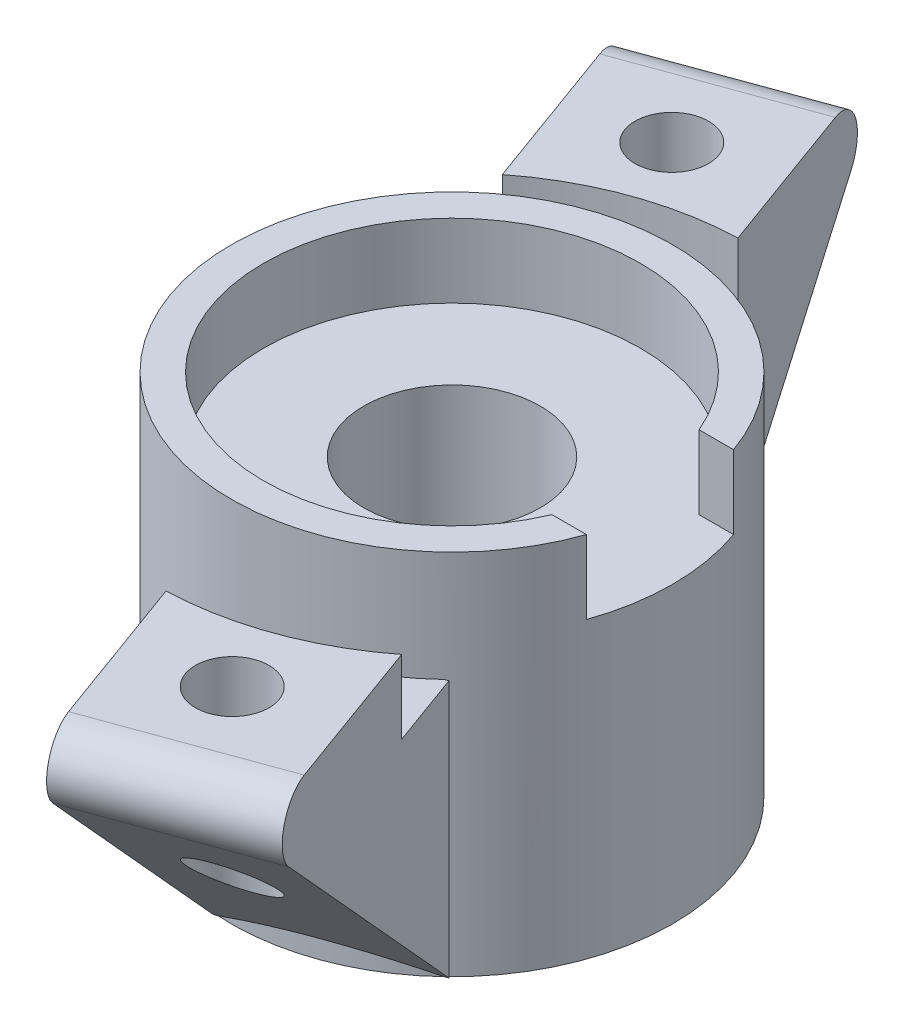
ISO-10303-21;
HEADER;
FILE_DESCRIPTION(('STEP AP214'),'2;1');
FILE_NAME('part.step','',(''),(''),'','','');
FILE_SCHEMA(('AUTOMOTIVE_DESIGN { 1 0 10303 214 1 1 1 1 }'));
ENDSEC;
DATA;
#1=APPLICATION_CONTEXT('core data for automotive mechanical design processes');
#2=APPLICATION_PROTOCOL_DEFINITION('international standard','automotive_design',2000,#1);
#3=PRODUCT_CONTEXT('',#1,'mechanical');
#4=PRODUCT('Part','Part','',(#3));
#5=PRODUCT_RELATED_PRODUCT_CATEGORY('part','',(#4));
#6=PRODUCT_DEFINITION_FORMATION('','',#4);
#7=PRODUCT_DEFINITION_CONTEXT('part definition',#1,'design');
#8=PRODUCT_DEFINITION('design','',#6,#7);
#9=PRODUCT_DEFINITION_SHAPE('','',#8);
#10=(LENGTH_UNIT() NAMED_UNIT(*) SI_UNIT(.MILLI.,.METRE.));
#11=(NAMED_UNIT(*) PLANE_ANGLE_UNIT() SI_UNIT($,.RADIAN.));
#12=(NAMED_UNIT(*) SI_UNIT($,.STERADIAN.) SOLID_ANGLE_UNIT());
#13=UNCERTAINTY_MEASURE_WITH_UNIT(LENGTH_MEASURE(1.E-05),#10,'distance_accuracy_value','');
#14=(GEOMETRIC_REPRESENTATION_CONTEXT(3) GLOBAL_UNCERTAINTY_ASSIGNED_CONTEXT((#13)) GLOBAL_UNIT_ASSIGNED_CONTEXT((#10,
#11,#12)) REPRESENTATION_CONTEXT('',''));
#15=CARTESIAN_POINT('',(0.,0.,0.));
#16=DIRECTION('',(0.,0.,1.));
#17=DIRECTION('',(1.,0.,0.));
#18=AXIS2_PLACEMENT_3D('',#15,#16,#17);
#19=CARTESIAN_POINT('',(8.46068468051187,-2.,8.62651811201667));
#20=DIRECTION('',(0.342020143325666,0.,0.939692620785909));
#21=DIRECTION('',(0.939692620785909,0.,-0.342020143325666));
#22=AXIS2_PLACEMENT_3D('',#19,#20,#21);
#23=PLANE('',#22);
#24=DIRECTION('',(-0.939692620785909,0.,0.342020143325666));
#25=VECTOR('',#24,1.);
#26=CARTESIAN_POINT('',(8.46068468051187,-6.,8.62651811201667));
#27=LINE('',#26,#25);
#28=CARTESIAN_POINT('',(8.46068468051187,-6.,8.62651811201667));
#29=VERTEX_POINT('',#28);
#30=CARTESIAN_POINT('',(8.26882906957174,-6.,8.69634784367583));
#31=VERTEX_POINT('',#30);
#32=EDGE_CURVE('E203',#29,#31,#27,.T.);
#33=ORIENTED_EDGE('',*,*,#32,.F.);
#34=DIRECTION('',(0.,1.,0.));
#35=VECTOR('',#34,1.);
#36=CARTESIAN_POINT('',(8.46068468051187,-2.,8.62651811201667));
#37=LINE('',#36,#35);
#38=CARTESIAN_POINT('',(8.46068468051187,-20.,8.62651811201667));
#39=VERTEX_POINT('',#38);
#40=EDGE_CURVE('E198',#39,#29,#37,.T.);
#41=ORIENTED_EDGE('',*,*,#40,.F.);
#42=DIRECTION('',(-0.939692620785909,0.,0.342020143325666));
#43=VECTOR('',#42,1.);
#44=CARTESIAN_POINT('',(8.46068468051187,-20.,8.62651811201667));
#45=LINE('',#44,#43);
#46=CARTESIAN_POINT('',(8.26882906957174,-20.,8.69634784367584));
#47=VERTEX_POINT('',#46);
#48=EDGE_CURVE('E216',#39,#47,#45,.T.);
#49=ORIENTED_EDGE('',*,*,#48,.T.);
#50=DIRECTION('',(0.,1.,0.));
#51=VECTOR('',#50,1.);
#52=CARTESIAN_POINT('',(8.26882906957175,-20.,8.69634784367583));
#53=LINE('',#52,#51);
#54=EDGE_CURVE('E222',#31,#47,#53,.F.);
#55=ORIENTED_EDGE('',*,*,#54,.F.);
#56=EDGE_LOOP('',(#33,#41,#49,#55));
#57=FACE_BOUND('',#56,.T.);
#58=ADVANCED_FACE('F41',(#57),#23,.F.);
#59=CARTESIAN_POINT('',(14.6170472603738,-2.,25.5409852861629));
#60=DIRECTION('',(0.,-1.,0.));
#61=DIRECTION('',(0.,0.,-1.));
#62=AXIS2_PLACEMENT_3D('',#59,#60,#61);
#63=PLANE('',#62);
#64=CARTESIAN_POINT('',(6.84040286651332,-2.,18.7938524157182));
#65=DIRECTION('',(0.,-1.,0.));
#66=DIRECTION('',(-0.642787609686535,0.,-0.766044443118982));
#67=AXIS2_PLACEMENT_3D('',#64,#65,#66);
#68=CIRCLE('',#67,2.);
#69=CARTESIAN_POINT('',(5.55482764714025,-2.,17.2617635294802));
#70=VERTEX_POINT('',#69);
#71=EDGE_CURVE('E413',#70,#70,#68,.T.);
#72=ORIENTED_EDGE('',*,*,#71,.T.);
#73=EDGE_LOOP('',(#72));
#74=FACE_BOUND('',#73,.T.);
#75=DIRECTION('',(0.342020143325666,0.,0.939692620785909));
#76=VECTOR('',#75,1.);
#77=CARTESIAN_POINT('',(5.2201210525147,-2.,28.9611867194195));
#78=LINE('',#77,#76);
#79=CARTESIAN_POINT('',(0.535786172571495,-2.,16.0910824116118));
#80=VERTEX_POINT('',#79);
#81=CARTESIAN_POINT('',(3.56870171527149,-2.,24.423949380293));
#82=VERTEX_POINT('',#81);
#83=EDGE_CURVE('E201',#80,#82,#78,.T.);
#84=ORIENTED_EDGE('',*,*,#83,.T.);
#85=DIRECTION('',(-0.939692620785909,0.,0.342020143325666));
#86=VECTOR('',#85,1.);
#87=CARTESIAN_POINT('',(12.9656279231306,-2.,21.0037479470364));
#88=LINE('',#87,#86);
#89=CARTESIAN_POINT('',(12.9656279231306,-2.,21.0037479470364));
#90=VERTEX_POINT('',#89);
#91=EDGE_CURVE('E47',#82,#90,#88,.F.);
#92=ORIENTED_EDGE('',*,*,#91,.T.);
#93=DIRECTION('',(0.342020143325666,0.,0.939692620785909));
#94=VECTOR('',#93,1.);
#95=CARTESIAN_POINT('',(14.6170472603738,-2.,25.5409852861629));
#96=LINE('',#95,#94);
#97=CARTESIAN_POINT('',(9.93271238043059,-2.,12.6708809783551));
#98=VERTEX_POINT('',#97);
#99=EDGE_CURVE('E212',#98,#90,#96,.T.);
#100=ORIENTED_EDGE('',*,*,#99,.F.);
#101=CARTESIAN_POINT('',(0.,-2.,0.));
#102=DIRECTION('',(0.,-1.,0.));
#103=DIRECTION('',(0.,0.,-1.));
#104=AXIS2_PLACEMENT_3D('',#101,#102,#103);
#105=CIRCLE('',#104,16.1);
#106=EDGE_CURVE('E182',#80,#98,#105,.F.);
#107=ORIENTED_EDGE('',*,*,#106,.F.);
#108=EDGE_LOOP('',(#84,#92,#100,#107));
#109=FACE_BOUND('',#108,.T.);
#110=ADVANCED_FACE('F438',(#74,#109),#63,.F.);
#111=DIRECTION('',(-0.939692620785909,0.,0.342020143325666));
#112=VECTOR('',#111,1.);
#113=CARTESIAN_POINT('',(8.46068468051187,-6.,8.62651811201667));
#114=LINE('',#113,#112);
#115=CARTESIAN_POINT('',(-0.744385916407087,-6.,11.9768898136142));
#116=VERTEX_POINT('',#115);
#117=CARTESIAN_POINT('',(-0.936241527347218,-6.,12.0467195452733));
#118=VERTEX_POINT('',#117);
#119=EDGE_CURVE('E187',#116,#118,#114,.T.);
#120=ORIENTED_EDGE('',*,*,#119,.F.);
#121=DIRECTION('',(0.,1.,0.));
#122=VECTOR('',#121,1.);
#123=CARTESIAN_POINT('',(-0.744385916407087,-20.,11.9768898136142));
#124=LINE('',#123,#122);
#125=CARTESIAN_POINT('',(-0.744385916407084,-20.,11.9768898136142));
#126=VERTEX_POINT('',#125);
#127=EDGE_CURVE('E225',#126,#116,#124,.T.);
#128=ORIENTED_EDGE('',*,*,#127,.F.);
#129=CARTESIAN_POINT('',(-0.936241527347223,-20.,12.0467195452733));
#130=VERTEX_POINT('',#129);
#131=EDGE_CURVE('E219',#126,#130,#45,.T.);
#132=ORIENTED_EDGE('',*,*,#131,.T.);
#133=DIRECTION('',(0.,1.,0.));
#134=VECTOR('',#133,1.);
#135=CARTESIAN_POINT('',(-0.936241527347223,-2.,12.0467195452733));
#136=LINE('',#135,#134);
#137=EDGE_CURVE('E206',#130,#118,#136,.T.);
#138=ORIENTED_EDGE('',*,*,#137,.T.);
#139=EDGE_LOOP('',(#120,#128,#132,#138));
#140=FACE_BOUND('',#139,.T.);
#141=ADVANCED_FACE('F357',(#140),#23,.F.);
#142=CARTESIAN_POINT('',(4.69846310392955,0.,-1.71010071662833));
#143=DIRECTION('',(0.939692620785909,0.,-0.342020143325666));
#144=DIRECTION('',(0.342020143325666,0.,0.93969262078591));
#145=AXIS2_PLACEMENT_3D('',#142,#143,#144);
#146=PLANE('',#145);
#147=ORIENTED_EDGE('',*,*,#99,.T.);
#148=CARTESIAN_POINT('',(12.9656279231306,-4.,21.0037479470364));
#149=DIRECTION('',(0.939692620785909,0.,-0.342020143325666));
#150=DIRECTION('',(-0.342020143325666,0.,-0.939692620785909));
#151=AXIS2_PLACEMENT_3D('',#148,#149,#150);
#152=CIRCLE('',#151,2.);
#153=CARTESIAN_POINT('',(13.4493174484265,-5.41421356237309,22.3326739958137));
#154=VERTEX_POINT('',#153);
#155=EDGE_CURVE('E11',#90,#154,#152,.T.);
#156=ORIENTED_EDGE('',*,*,#155,.T.);
#157=DIRECTION('',(-0.241844762647972,-0.707106781186551,-0.664463024388672));
#158=VECTOR('',#157,1.);
#159=CARTESIAN_POINT('',(8.46068468051187,-20.,8.62651811201667));
#160=LINE('',#159,#158);
#161=EDGE_CURVE('E217',#154,#39,#160,.T.);
#162=ORIENTED_EDGE('',*,*,#161,.T.);
#163=ORIENTED_EDGE('',*,*,#40,.T.);
#164=DIRECTION('',(0.342020143325666,0.,0.939692620785909));
#165=VECTOR('',#164,1.);
#166=CARTESIAN_POINT('',(4.69846310392955,-6.,-1.71010071662833));
#167=LINE('',#166,#165);
#168=CARTESIAN_POINT('',(9.93271238043059,-6.,12.6708809783551));
#169=VERTEX_POINT('',#168);
#170=EDGE_CURVE('E188',#29,#169,#167,.T.);
#171=ORIENTED_EDGE('',*,*,#170,.T.);
#172=DIRECTION('',(0.,1.,0.));
#173=VECTOR('',#172,1.);
#174=CARTESIAN_POINT('',(9.93271238043059,-6.,12.6708809783551));
#175=LINE('',#174,#173);
#176=EDGE_CURVE('E180',#169,#98,#175,.T.);
#177=ORIENTED_EDGE('',*,*,#176,.T.);
#178=EDGE_LOOP('',(#147,#156,#162,#163,#171,#177));
#179=FACE_BOUND('',#178,.T.);
#180=ADVANCED_FACE('F199',(#179),#146,.T.);
#181=CARTESIAN_POINT('',(-4.69846310392955,0.,1.71010071662833));
#182=DIRECTION('',(0.939692620785909,0.,-0.342020143325666));
#183=DIRECTION('',(0.342020143325666,0.,0.93969262078591));
#184=AXIS2_PLACEMENT_3D('',#181,#182,#183);
#185=PLANE('',#184);
#186=DIRECTION('',(-0.241844762647972,-0.707106781186551,-0.664463024388672));
#187=VECTOR('',#186,1.);
#188=CARTESIAN_POINT('',(-0.936241527347223,-20.,12.0467195452733));
#189=LINE('',#188,#187);
#190=CARTESIAN_POINT('',(4.05239124056744,-5.41421356237309,25.7528754290704));
#191=VERTEX_POINT('',#190);
#192=EDGE_CURVE('E213',#191,#130,#189,.T.);
#193=ORIENTED_EDGE('',*,*,#192,.F.);
#194=CARTESIAN_POINT('',(3.5687017152715,-4.,24.423949380293));
#195=DIRECTION('',(0.939692620785909,0.,-0.342020143325666));
#196=DIRECTION('',(-0.342020143325666,0.,-0.939692620785909));
#197=AXIS2_PLACEMENT_3D('',#194,#195,#196);
#198=CIRCLE('',#197,2.);
#199=EDGE_CURVE('E62',#191,#82,#198,.F.);
#200=ORIENTED_EDGE('',*,*,#199,.T.);
#201=ORIENTED_EDGE('',*,*,#83,.F.);
#202=DIRECTION('',(0.,1.,0.));
#203=VECTOR('',#202,1.);
#204=CARTESIAN_POINT('',(0.535786172571495,-6.,16.0910824116118));
#205=LINE('',#204,#203);
#206=CARTESIAN_POINT('',(0.535786172571495,-6.,16.0910824116118));
#207=VERTEX_POINT('',#206);
#208=EDGE_CURVE('E336',#207,#80,#205,.T.);
#209=ORIENTED_EDGE('',*,*,#208,.F.);
#210=DIRECTION('',(0.342020143325666,0.,0.939692620785909));
#211=VECTOR('',#210,1.);
#212=CARTESIAN_POINT('',(-4.69846310392955,-6.,1.71010071662833));
#213=LINE('',#212,#211);
#214=EDGE_CURVE('E192',#118,#207,#213,.T.);
#215=ORIENTED_EDGE('',*,*,#214,.F.);
#216=ORIENTED_EDGE('',*,*,#137,.F.);
#217=EDGE_LOOP('',(#193,#200,#201,#209,#215,#216));
#218=FACE_BOUND('',#217,.T.);
#219=ADVANCED_FACE('F354',(#218),#185,.F.);
#220=CARTESIAN_POINT('',(0.,-20.,0.));
#221=DIRECTION('',(0.,1.,0.));
#222=DIRECTION('',(0.,0.,1.));
#223=AXIS2_PLACEMENT_3D('',#220,#221,#222);
#224=CYLINDRICAL_SURFACE('',#223,12.);
#225=CARTESIAN_POINT('',(0.,-6.,0.));
#226=DIRECTION('',(0.,-1.,0.));
#227=DIRECTION('',(-0.642787609686535,0.,-0.766044443118982));
#228=AXIS2_PLACEMENT_3D('',#225,#226,#227);
#229=CIRCLE('',#228,12.);
#230=EDGE_CURVE('E191',#31,#116,#229,.T.);
#231=ORIENTED_EDGE('',*,*,#230,.F.);
#232=ORIENTED_EDGE('',*,*,#54,.T.);
#233=CARTESIAN_POINT('',(0.,-20.,0.));
#234=DIRECTION('',(0.,1.,0.));
#235=DIRECTION('',(0.,0.,1.));
#236=AXIS2_PLACEMENT_3D('',#233,#234,#235);
#237=CIRCLE('',#236,12.);
#238=CARTESIAN_POINT('',(0.744385916407095,-20.,-11.9768898136142));
#239=VERTEX_POINT('',#238);
#240=EDGE_CURVE('E313',#47,#239,#237,.T.);
#241=ORIENTED_EDGE('',*,*,#240,.T.);
#242=DIRECTION('',(0.,1.,0.));
#243=VECTOR('',#242,1.);
#244=CARTESIAN_POINT('',(0.744385916407098,-20.,-11.9768898136142));
#245=LINE('',#244,#243);
#246=CARTESIAN_POINT('',(0.744385916407098,-6.,-11.9768898136142));
#247=VERTEX_POINT('',#246);
#248=EDGE_CURVE('E276',#247,#239,#245,.F.);
#249=ORIENTED_EDGE('',*,*,#248,.F.);
#250=CARTESIAN_POINT('',(0.,-6.,0.));
#251=DIRECTION('',(0.,1.,0.));
#252=DIRECTION('',(0.,0.,1.));
#253=AXIS2_PLACEMENT_3D('',#250,#251,#252);
#254=CIRCLE('',#253,12.);
#255=CARTESIAN_POINT('',(-8.26882906957175,-6.,-8.69634784367583));
#256=VERTEX_POINT('',#255);
#257=EDGE_CURVE('E234',#247,#256,#254,.T.);
#258=ORIENTED_EDGE('',*,*,#257,.T.);
#259=DIRECTION('',(0.,1.,0.));
#260=VECTOR('',#259,1.);
#261=CARTESIAN_POINT('',(-8.26882906957175,-20.,-8.69634784367583));
#262=LINE('',#261,#260);
#263=CARTESIAN_POINT('',(-8.26882906957175,-20.,-8.69634784367583));
#264=VERTEX_POINT('',#263);
#265=EDGE_CURVE('E279',#264,#256,#262,.T.);
#266=ORIENTED_EDGE('',*,*,#265,.F.);
#267=EDGE_CURVE('E312',#264,#126,#237,.T.);
#268=ORIENTED_EDGE('',*,*,#267,.T.);
#269=ORIENTED_EDGE('',*,*,#127,.T.);
#270=EDGE_LOOP('',(#231,#232,#241,#249,#258,#266,#268,#269));
#271=FACE_BOUND('',#270,.T.);
#272=DIRECTION('',(0.,1.,0.));
#273=VECTOR('',#272,1.);
#274=CARTESIAN_POINT('',(11.3137084989848,-20.,4.));
#275=LINE('',#274,#273);
#276=CARTESIAN_POINT('',(11.3137084989848,0.,4.));
#277=VERTEX_POINT('',#276);
#278=CARTESIAN_POINT('',(11.3137084989848,-4.,4.));
#279=VERTEX_POINT('',#278);
#280=EDGE_CURVE('E300',#277,#279,#275,.F.);
#281=ORIENTED_EDGE('',*,*,#280,.F.);
#282=CARTESIAN_POINT('',(0.,0.,0.));
#283=DIRECTION('',(0.,1.,0.));
#284=DIRECTION('',(0.,0.,1.));
#285=AXIS2_PLACEMENT_3D('',#282,#283,#284);
#286=CIRCLE('',#285,12.);
#287=CARTESIAN_POINT('',(11.3137084989848,0.,-4.));
#288=VERTEX_POINT('',#287);
#289=EDGE_CURVE('E307',#288,#277,#286,.T.);
#290=ORIENTED_EDGE('',*,*,#289,.F.);
#291=DIRECTION('',(0.,1.,0.));
#292=VECTOR('',#291,1.);
#293=CARTESIAN_POINT('',(11.3137084989848,-20.,-4.));
#294=LINE('',#293,#292);
#295=CARTESIAN_POINT('',(11.3137084989848,-4.,-4.));
#296=VERTEX_POINT('',#295);
#297=EDGE_CURVE('E294',#296,#288,#294,.T.);
#298=ORIENTED_EDGE('',*,*,#297,.F.);
#299=CARTESIAN_POINT('',(0.,-4.,0.));
#300=DIRECTION('',(0.,1.,0.));
#301=DIRECTION('',(0.,0.,1.));
#302=AXIS2_PLACEMENT_3D('',#299,#300,#301);
#303=CIRCLE('',#302,12.);
#304=EDGE_CURVE('E292',#296,#279,#303,.F.);
#305=ORIENTED_EDGE('',*,*,#304,.T.);
#306=EDGE_LOOP('',(#281,#290,#298,#305));
#307=FACE_BOUND('',#306,.T.);
#308=ADVANCED_FACE('F372',(#271,#307),#224,.T.);
#309=EDGE_CURVE('E361',#126,#47,#237,.T.);
#310=ORIENTED_EDGE('',*,*,#309,.T.);
#311=CARTESIAN_POINT('',(0.,-31.0000000000001,0.));
#312=DIRECTION('',(-0.241844762647975,0.707106781186544,-0.664463024388679));
#313=DIRECTION('',(0.241844762647972,0.707106781186551,0.664463024388672));
#314=AXIS2_PLACEMENT_3D('',#311,#312,#313);
#315=ELLIPSE('',#314,16.9705627484772,12.);
#316=EDGE_CURVE('E227',#47,#126,#315,.F.);
#317=ORIENTED_EDGE('',*,*,#316,.T.);
#318=EDGE_LOOP('',(#310,#317));
#319=FACE_BOUND('',#318,.T.);
#320=ADVANCED_FACE('F365',(#319),#224,.T.);
#321=CARTESIAN_POINT('',(0.936241527347221,-2.,-12.0467195452733));
#322=DIRECTION('',(0.342020143325666,0.,0.939692620785909));
#323=DIRECTION('',(0.939692620785909,0.,-0.342020143325666));
#324=AXIS2_PLACEMENT_3D('',#321,#322,#323);
#325=PLANE('',#324);
#326=DIRECTION('',(0.,1.,0.));
#327=VECTOR('',#326,1.);
#328=CARTESIAN_POINT('',(0.936241527347221,-2.,-12.0467195452733));
#329=LINE('',#328,#327);
#330=CARTESIAN_POINT('',(0.936241527347221,-20.,-12.0467195452733));
#331=VERTEX_POINT('',#330);
#332=CARTESIAN_POINT('',(0.936241527347222,-6.,-12.0467195452733));
#333=VERTEX_POINT('',#332);
#334=EDGE_CURVE('E270',#331,#333,#329,.T.);
#335=ORIENTED_EDGE('',*,*,#334,.T.);
#336=DIRECTION('',(-0.939692620785909,0.,0.342020143325666));
#337=VECTOR('',#336,1.);
#338=CARTESIAN_POINT('',(0.936241527347221,-6.,-12.0467195452733));
#339=LINE('',#338,#337);
#340=EDGE_CURVE('E250',#333,#247,#339,.T.);
#341=ORIENTED_EDGE('',*,*,#340,.T.);
#342=ORIENTED_EDGE('',*,*,#248,.T.);
#343=DIRECTION('',(-0.939692620785909,0.,0.342020143325666));
#344=VECTOR('',#343,1.);
#345=CARTESIAN_POINT('',(0.936241527347221,-20.,-12.0467195452733));
#346=LINE('',#345,#344);
#347=EDGE_CURVE('E272',#331,#239,#346,.T.);
#348=ORIENTED_EDGE('',*,*,#347,.F.);
#349=EDGE_LOOP('',(#335,#341,#342,#348));
#350=FACE_BOUND('',#349,.T.);
#351=ADVANCED_FACE('F415',(#350),#325,.T.);
#352=ORIENTED_EDGE('',*,*,#265,.T.);
#353=DIRECTION('',(-0.939692620785909,0.,0.342020143325666));
#354=VECTOR('',#353,1.);
#355=CARTESIAN_POINT('',(0.936241527347221,-6.,-12.0467195452733));
#356=LINE('',#355,#354);
#357=CARTESIAN_POINT('',(-8.46068468051187,-6.,-8.62651811201667));
#358=VERTEX_POINT('',#357);
#359=EDGE_CURVE('E241',#256,#358,#356,.T.);
#360=ORIENTED_EDGE('',*,*,#359,.T.);
#361=DIRECTION('',(0.,1.,0.));
#362=VECTOR('',#361,1.);
#363=CARTESIAN_POINT('',(-8.46068468051187,-2.,-8.62651811201667));
#364=LINE('',#363,#362);
#365=CARTESIAN_POINT('',(-8.46068468051187,-20.,-8.62651811201667));
#366=VERTEX_POINT('',#365);
#367=EDGE_CURVE('E260',#366,#358,#364,.T.);
#368=ORIENTED_EDGE('',*,*,#367,.F.);
#369=EDGE_CURVE('E267',#264,#366,#346,.T.);
#370=ORIENTED_EDGE('',*,*,#369,.F.);
#371=EDGE_LOOP('',(#352,#360,#368,#370));
#372=FACE_BOUND('',#371,.T.);
#373=ADVANCED_FACE('F389',(#372),#325,.T.);
#374=CARTESIAN_POINT('',(0.,-20.,0.));
#375=DIRECTION('',(0.,1.,0.));
#376=DIRECTION('',(0.,0.,1.));
#377=AXIS2_PLACEMENT_3D('',#374,#375,#376);
#378=CYLINDRICAL_SURFACE('',#377,4.8);
#379=CARTESIAN_POINT('',(0.,-20.,0.));
#380=DIRECTION('',(0.,1.,0.));
#381=DIRECTION('',(0.,0.,1.));
#382=AXIS2_PLACEMENT_3D('',#379,#380,#381);
#383=CIRCLE('',#382,4.8);
#384=CARTESIAN_POINT('',(0.,-20.,4.8));
#385=VERTEX_POINT('',#384);
#386=EDGE_CURVE('E306',#385,#385,#383,.T.);
#387=ORIENTED_EDGE('',*,*,#386,.F.);
#388=EDGE_LOOP('',(#387));
#389=FACE_BOUND('',#388,.T.);
#390=CARTESIAN_POINT('',(0.,-4.,0.));
#391=DIRECTION('',(0.,1.,0.));
#392=DIRECTION('',(0.,0.,1.));
#393=AXIS2_PLACEMENT_3D('',#390,#391,#392);
#394=CIRCLE('',#393,4.8);
#395=CARTESIAN_POINT('',(0.,-4.,4.8));
#396=VERTEX_POINT('',#395);
#397=EDGE_CURVE('E303',#396,#396,#394,.F.);
#398=ORIENTED_EDGE('',*,*,#397,.F.);
#399=EDGE_LOOP('',(#398));
#400=FACE_BOUND('',#399,.T.);
#401=ADVANCED_FACE('F472',(#389,#400),#378,.F.);
#402=CARTESIAN_POINT('',(0.,-31.0000000000001,0.));
#403=DIRECTION('',(-0.241844762647975,-0.707106781186544,-0.664463024388679));
#404=DIRECTION('',(-0.241844762647972,0.707106781186551,-0.664463024388672));
#405=AXIS2_PLACEMENT_3D('',#402,#403,#404);
#406=ELLIPSE('',#405,16.9705627484772,12.);
#407=EDGE_CURVE('E274',#239,#264,#406,.F.);
#408=ORIENTED_EDGE('',*,*,#407,.F.);
#409=EDGE_CURVE('E309',#239,#264,#237,.T.);
#410=ORIENTED_EDGE('',*,*,#409,.T.);
#411=EDGE_LOOP('',(#408,#410));
#412=FACE_BOUND('',#411,.T.);
#413=ADVANCED_FACE('F468',(#412),#224,.T.);
#414=CARTESIAN_POINT('',(0.,-20.,0.));
#415=DIRECTION('',(0.,1.,0.));
#416=DIRECTION('',(0.,0.,1.));
#417=AXIS2_PLACEMENT_3D('',#414,#415,#416);
#418=PLANE('',#417);
#419=ORIENTED_EDGE('',*,*,#309,.F.);
#420=ORIENTED_EDGE('',*,*,#267,.F.);
#421=ORIENTED_EDGE('',*,*,#409,.F.);
#422=ORIENTED_EDGE('',*,*,#240,.F.);
#423=EDGE_LOOP('',(#419,#420,#421,#422));
#424=FACE_BOUND('',#423,.T.);
#425=ORIENTED_EDGE('',*,*,#386,.T.);
#426=EDGE_LOOP('',(#425));
#427=FACE_BOUND('',#426,.T.);
#428=ADVANCED_FACE('F368',(#424,#427),#418,.F.);
#429=CARTESIAN_POINT('',(0.,0.,0.));
#430=DIRECTION('',(0.,1.,0.));
#431=DIRECTION('',(0.,0.,1.));
#432=AXIS2_PLACEMENT_3D('',#429,#430,#431);
#433=PLANE('',#432);
#434=DIRECTION('',(1.,0.,0.));
#435=VECTOR('',#434,1.);
#436=CARTESIAN_POINT('',(5.44855321152116,0.,4.));
#437=LINE('',#436,#435);
#438=CARTESIAN_POINT('',(9.43729304408844,0.,4.));
#439=VERTEX_POINT('',#438);
#440=EDGE_CURVE('E290',#439,#277,#437,.T.);
#441=ORIENTED_EDGE('',*,*,#440,.F.);
#442=CARTESIAN_POINT('',(0.,0.,0.));
#443=DIRECTION('',(0.,1.,0.));
#444=DIRECTION('',(0.,0.,1.));
#445=AXIS2_PLACEMENT_3D('',#442,#443,#444);
#446=CIRCLE('',#445,10.25);
#447=CARTESIAN_POINT('',(9.43729304408844,0.,-4.));
#448=VERTEX_POINT('',#447);
#449=EDGE_CURVE('E299',#448,#439,#446,.T.);
#450=ORIENTED_EDGE('',*,*,#449,.F.);
#451=DIRECTION('',(-1.,0.,0.));
#452=VECTOR('',#451,1.);
#453=CARTESIAN_POINT('',(5.44855321152115,0.,-4.));
#454=LINE('',#453,#452);
#455=EDGE_CURVE('E284',#288,#448,#454,.T.);
#456=ORIENTED_EDGE('',*,*,#455,.F.);
#457=ORIENTED_EDGE('',*,*,#289,.T.);
#458=EDGE_LOOP('',(#441,#450,#456,#457));
#459=FACE_BOUND('',#458,.T.);
#460=ADVANCED_FACE('F475',(#459),#433,.T.);
#461=CARTESIAN_POINT('',(0.,-4.,0.));
#462=DIRECTION('',(0.,1.,0.));
#463=DIRECTION('',(0.,0.,1.));
#464=AXIS2_PLACEMENT_3D('',#461,#462,#463);
#465=PLANE('',#464);
#466=CARTESIAN_POINT('',(0.,-4.,0.));
#467=DIRECTION('',(0.,1.,0.));
#468=DIRECTION('',(0.,0.,1.));
#469=AXIS2_PLACEMENT_3D('',#466,#467,#468);
#470=CIRCLE('',#469,10.25);
#471=CARTESIAN_POINT('',(9.43729304408844,-4.,-4.));
#472=VERTEX_POINT('',#471);
#473=CARTESIAN_POINT('',(9.43729304408844,-4.,4.));
#474=VERTEX_POINT('',#473);
#475=EDGE_CURVE('E297',#472,#474,#470,.T.);
#476=ORIENTED_EDGE('',*,*,#475,.T.);
#477=DIRECTION('',(-1.,0.,0.));
#478=VECTOR('',#477,1.);
#479=CARTESIAN_POINT('',(5.44855321152116,-4.,4.));
#480=LINE('',#479,#478);
#481=EDGE_CURVE('E281',#279,#474,#480,.T.);
#482=ORIENTED_EDGE('',*,*,#481,.F.);
#483=ORIENTED_EDGE('',*,*,#304,.F.);
#484=DIRECTION('',(1.,0.,0.));
#485=VECTOR('',#484,1.);
#486=CARTESIAN_POINT('',(5.44855321152115,-4.,-4.));
#487=LINE('',#486,#485);
#488=EDGE_CURVE('E288',#472,#296,#487,.T.);
#489=ORIENTED_EDGE('',*,*,#488,.F.);
#490=EDGE_LOOP('',(#476,#482,#483,#489));
#491=FACE_BOUND('',#490,.T.);
#492=ORIENTED_EDGE('',*,*,#397,.T.);
#493=EDGE_LOOP('',(#492));
#494=FACE_BOUND('',#493,.T.);
#495=ADVANCED_FACE('F480',(#491,#494),#465,.T.);
#496=CARTESIAN_POINT('',(0.,-4.,0.));
#497=DIRECTION('',(0.,1.,0.));
#498=DIRECTION('',(0.,0.,1.));
#499=AXIS2_PLACEMENT_3D('',#496,#497,#498);
#500=CYLINDRICAL_SURFACE('',#499,10.25);
#501=ORIENTED_EDGE('',*,*,#449,.T.);
#502=DIRECTION('',(0.,1.,0.));
#503=VECTOR('',#502,1.);
#504=CARTESIAN_POINT('',(9.43729304408844,-4.,4.));
#505=LINE('',#504,#503);
#506=EDGE_CURVE('E323',#439,#474,#505,.F.);
#507=ORIENTED_EDGE('',*,*,#506,.T.);
#508=ORIENTED_EDGE('',*,*,#475,.F.);
#509=DIRECTION('',(0.,1.,0.));
#510=VECTOR('',#509,1.);
#511=CARTESIAN_POINT('',(9.43729304408844,-4.,-4.));
#512=LINE('',#511,#510);
#513=EDGE_CURVE('E315',#472,#448,#512,.T.);
#514=ORIENTED_EDGE('',*,*,#513,.T.);
#515=EDGE_LOOP('',(#501,#507,#508,#514));
#516=FACE_BOUND('',#515,.T.);
#517=ADVANCED_FACE('F481',(#516),#500,.F.);
#518=CARTESIAN_POINT('',(5.44855321152116,-17.6298466358076,4.));
#519=DIRECTION('',(0.,0.,1.));
#520=DIRECTION('',(1.,0.,0.));
#521=AXIS2_PLACEMENT_3D('',#518,#519,#520);
#522=PLANE('',#521);
#523=ORIENTED_EDGE('',*,*,#280,.T.);
#524=ORIENTED_EDGE('',*,*,#481,.T.);
#525=ORIENTED_EDGE('',*,*,#506,.F.);
#526=ORIENTED_EDGE('',*,*,#440,.T.);
#527=EDGE_LOOP('',(#523,#524,#525,#526));
#528=FACE_BOUND('',#527,.T.);
#529=ADVANCED_FACE('F488',(#528),#522,.F.);
#530=CARTESIAN_POINT('',(5.44855321152115,-17.6298466358076,-4.));
#531=DIRECTION('',(0.,0.,-1.));
#532=DIRECTION('',(-1.,0.,0.));
#533=AXIS2_PLACEMENT_3D('',#530,#531,#532);
#534=PLANE('',#533);
#535=ORIENTED_EDGE('',*,*,#297,.T.);
#536=ORIENTED_EDGE('',*,*,#455,.T.);
#537=ORIENTED_EDGE('',*,*,#513,.F.);
#538=ORIENTED_EDGE('',*,*,#488,.T.);
#539=EDGE_LOOP('',(#535,#536,#537,#538));
#540=FACE_BOUND('',#539,.T.);
#541=ADVANCED_FACE('F493',(#540),#534,.F.);
#542=CARTESIAN_POINT('',(-5.2201210525147,-2.,-28.9611867194195));
#543=DIRECTION('',(0.,1.,0.));
#544=DIRECTION('',(0.,0.,1.));
#545=AXIS2_PLACEMENT_3D('',#542,#543,#544);
#546=PLANE('',#545);
#547=CARTESIAN_POINT('',(-6.84040286651332,-2.,-18.7938524157182));
#548=DIRECTION('',(0.,1.,0.));
#549=DIRECTION('',(0.,0.,1.));
#550=AXIS2_PLACEMENT_3D('',#547,#548,#549);
#551=CIRCLE('',#550,2.);
#552=CARTESIAN_POINT('',(-6.84040286651332,-2.,-16.7938524157182));
#553=VERTEX_POINT('',#552);
#554=EDGE_CURVE('E233',#553,#553,#551,.T.);
#555=ORIENTED_EDGE('',*,*,#554,.F.);
#556=EDGE_LOOP('',(#555));
#557=FACE_BOUND('',#556,.T.);
#558=DIRECTION('',(-0.342020143325666,0.,-0.939692620785909));
#559=VECTOR('',#558,1.);
#560=CARTESIAN_POINT('',(-5.2201210525147,-2.,-28.9611867194195));
#561=LINE('',#560,#559);
#562=CARTESIAN_POINT('',(-0.535786172571491,-2.,-16.0910824116118));
#563=VERTEX_POINT('',#562);
#564=CARTESIAN_POINT('',(-3.56870171527149,-2.,-24.423949380293));
#565=VERTEX_POINT('',#564);
#566=EDGE_CURVE('E265',#563,#565,#561,.T.);
#567=ORIENTED_EDGE('',*,*,#566,.T.);
#568=DIRECTION('',(-0.939692620785909,0.,0.342020143325666));
#569=VECTOR('',#568,1.);
#570=CARTESIAN_POINT('',(-3.56870171527149,-2.,-24.423949380293));
#571=LINE('',#570,#569);
#572=CARTESIAN_POINT('',(-12.9656279231306,-2.,-21.0037479470364));
#573=VERTEX_POINT('',#572);
#574=EDGE_CURVE('E326',#565,#573,#571,.T.);
#575=ORIENTED_EDGE('',*,*,#574,.T.);
#576=DIRECTION('',(-0.342020143325666,0.,-0.939692620785909));
#577=VECTOR('',#576,1.);
#578=CARTESIAN_POINT('',(-14.6170472603738,-2.,-25.5409852861629));
#579=LINE('',#578,#577);
#580=CARTESIAN_POINT('',(-9.93271238043059,-2.,-12.6708809783551));
#581=VERTEX_POINT('',#580);
#582=EDGE_CURVE('E251',#581,#573,#579,.T.);
#583=ORIENTED_EDGE('',*,*,#582,.F.);
#584=CARTESIAN_POINT('',(0.,-2.,0.));
#585=DIRECTION('',(0.,1.,0.));
#586=DIRECTION('',(0.,0.,1.));
#587=AXIS2_PLACEMENT_3D('',#584,#585,#586);
#588=CIRCLE('',#587,16.1);
#589=EDGE_CURVE('E249',#563,#581,#588,.T.);
#590=ORIENTED_EDGE('',*,*,#589,.F.);
#591=EDGE_LOOP('',(#567,#575,#583,#590));
#592=FACE_BOUND('',#591,.T.);
#593=ADVANCED_FACE('F404',(#557,#592),#546,.T.);
#594=CARTESIAN_POINT('',(0.936241527347221,-20.,-12.0467195452733));
#595=DIRECTION('',(-0.241844762647975,-0.707106781186544,-0.664463024388679));
#596=DIRECTION('',(0.,0.68479107877174,-0.728739444818679));
#597=AXIS2_PLACEMENT_3D('',#594,#595,#596);
#598=PLANE('',#597);
#599=CARTESIAN_POINT('',(-6.84040286651332,-10.9999999999999,-18.7938524157182));
#600=DIRECTION('',(-0.241844762647975,-0.707106781186544,-0.664463024388679));
#601=DIRECTION('',(-0.241844762647972,0.707106781186551,-0.664463024388672));
#602=AXIS2_PLACEMENT_3D('',#599,#600,#601);
#603=ELLIPSE('',#602,2.82842712474621,2.);
#604=CARTESIAN_POINT('',(-7.52444315316465,-8.99999999999989,-20.67323765729));
#605=VERTEX_POINT('',#604);
#606=EDGE_CURVE('E229',#605,#605,#603,.F.);
#607=ORIENTED_EDGE('',*,*,#606,.T.);
#608=EDGE_LOOP('',(#607));
#609=FACE_BOUND('',#608,.T.);
#610=DIRECTION('',(0.241844762647972,-0.707106781186551,0.664463024388672));
#611=VECTOR('',#610,1.);
#612=CARTESIAN_POINT('',(-8.46068468051187,-20.,-8.62651811201667));
#613=LINE('',#612,#611);
#614=CARTESIAN_POINT('',(-13.4493174484265,-5.41421356237309,-22.3326739958137));
#615=VERTEX_POINT('',#614);
#616=EDGE_CURVE('E259',#615,#366,#613,.T.);
#617=ORIENTED_EDGE('',*,*,#616,.F.);
#618=DIRECTION('',(-0.939692620785909,0.,0.342020143325666));
#619=VECTOR('',#618,1.);
#620=CARTESIAN_POINT('',(-4.05239124056744,-5.41421356237309,-25.7528754290704));
#621=LINE('',#620,#619);
#622=CARTESIAN_POINT('',(-4.05239124056744,-5.41421356237309,-25.7528754290704));
#623=VERTEX_POINT('',#622);
#624=EDGE_CURVE('E334',#615,#623,#621,.F.);
#625=ORIENTED_EDGE('',*,*,#624,.T.);
#626=DIRECTION('',(0.241844762647972,-0.707106781186551,0.664463024388672));
#627=VECTOR('',#626,1.);
#628=CARTESIAN_POINT('',(0.936241527347221,-20.,-12.0467195452733));
#629=LINE('',#628,#627);
#630=EDGE_CURVE('E263',#623,#331,#629,.T.);
#631=ORIENTED_EDGE('',*,*,#630,.T.);
#632=ORIENTED_EDGE('',*,*,#347,.T.);
#633=ORIENTED_EDGE('',*,*,#407,.T.);
#634=ORIENTED_EDGE('',*,*,#369,.T.);
#635=EDGE_LOOP('',(#617,#625,#631,#632,#633,#634));
#636=FACE_BOUND('',#635,.T.);
#637=ADVANCED_FACE('F384',(#609,#636),#598,.T.);
#638=CARTESIAN_POINT('',(4.69846310392955,0.,-1.71010071662833));
#639=DIRECTION('',(0.939692620785909,0.,-0.342020143325666));
#640=DIRECTION('',(-0.342020143325666,0.,-0.939692620785909));
#641=AXIS2_PLACEMENT_3D('',#638,#639,#640);
#642=PLANE('',#641);
#643=ORIENTED_EDGE('',*,*,#630,.F.);
#644=CARTESIAN_POINT('',(-3.56870171527149,-4.,-24.423949380293));
#645=DIRECTION('',(0.939692620785909,0.,-0.342020143325666));
#646=DIRECTION('',(-0.342020143325666,0.,-0.939692620785909));
#647=AXIS2_PLACEMENT_3D('',#644,#645,#646);
#648=CIRCLE('',#647,2.);
#649=EDGE_CURVE('E337',#623,#565,#648,.T.);
#650=ORIENTED_EDGE('',*,*,#649,.T.);
#651=ORIENTED_EDGE('',*,*,#566,.F.);
#652=DIRECTION('',(0.,1.,0.));
#653=VECTOR('',#652,1.);
#654=CARTESIAN_POINT('',(-0.535786172571491,-6.,-16.0910824116118));
#655=LINE('',#654,#653);
#656=CARTESIAN_POINT('',(-0.535786172571491,-6.,-16.0910824116118));
#657=VERTEX_POINT('',#656);
#658=EDGE_CURVE('E255',#657,#563,#655,.T.);
#659=ORIENTED_EDGE('',*,*,#658,.F.);
#660=DIRECTION('',(0.342020143325666,0.,0.939692620785909));
#661=VECTOR('',#660,1.);
#662=CARTESIAN_POINT('',(4.69846310392955,-6.,-1.71010071662833));
#663=LINE('',#662,#661);
#664=EDGE_CURVE('E242',#657,#333,#663,.T.);
#665=ORIENTED_EDGE('',*,*,#664,.T.);
#666=ORIENTED_EDGE('',*,*,#334,.F.);
#667=EDGE_LOOP('',(#643,#650,#651,#659,#665,#666));
#668=FACE_BOUND('',#667,.T.);
#669=ADVANCED_FACE('F399',(#668),#642,.T.);
#670=CARTESIAN_POINT('',(-4.69846310392955,0.,1.71010071662833));
#671=DIRECTION('',(0.939692620785909,0.,-0.342020143325666));
#672=DIRECTION('',(-0.342020143325666,0.,-0.939692620785909));
#673=AXIS2_PLACEMENT_3D('',#670,#671,#672);
#674=PLANE('',#673);
#675=ORIENTED_EDGE('',*,*,#582,.T.);
#676=CARTESIAN_POINT('',(-12.9656279231306,-4.,-21.0037479470364));
#677=DIRECTION('',(0.939692620785909,0.,-0.342020143325666));
#678=DIRECTION('',(-0.342020143325666,0.,-0.939692620785909));
#679=AXIS2_PLACEMENT_3D('',#676,#677,#678);
#680=CIRCLE('',#679,2.);
#681=EDGE_CURVE('E335',#573,#615,#680,.F.);
#682=ORIENTED_EDGE('',*,*,#681,.T.);
#683=ORIENTED_EDGE('',*,*,#616,.T.);
#684=ORIENTED_EDGE('',*,*,#367,.T.);
#685=DIRECTION('',(0.342020143325666,0.,0.939692620785909));
#686=VECTOR('',#685,1.);
#687=CARTESIAN_POINT('',(-4.69846310392955,-6.,1.71010071662833));
#688=LINE('',#687,#686);
#689=CARTESIAN_POINT('',(-9.93271238043059,-6.,-12.6708809783551));
#690=VERTEX_POINT('',#689);
#691=EDGE_CURVE('E325',#690,#358,#688,.T.);
#692=ORIENTED_EDGE('',*,*,#691,.F.);
#693=DIRECTION('',(0.,1.,0.));
#694=VECTOR('',#693,1.);
#695=CARTESIAN_POINT('',(-9.93271238043059,-6.,-12.6708809783551));
#696=LINE('',#695,#694);
#697=EDGE_CURVE('E327',#690,#581,#696,.T.);
#698=ORIENTED_EDGE('',*,*,#697,.T.);
#699=EDGE_LOOP('',(#675,#682,#683,#684,#692,#698));
#700=FACE_BOUND('',#699,.T.);
#701=ADVANCED_FACE('F386',(#700),#674,.F.);
#702=CARTESIAN_POINT('',(0.,-6.,0.));
#703=DIRECTION('',(0.,1.,0.));
#704=DIRECTION('',(0.,0.,1.));
#705=AXIS2_PLACEMENT_3D('',#702,#703,#704);
#706=CYLINDRICAL_SURFACE('',#705,16.1);
#707=ORIENTED_EDGE('',*,*,#658,.T.);
#708=ORIENTED_EDGE('',*,*,#589,.T.);
#709=ORIENTED_EDGE('',*,*,#697,.F.);
#710=CARTESIAN_POINT('',(0.,-6.,0.));
#711=DIRECTION('',(0.,1.,0.));
#712=DIRECTION('',(0.,0.,1.));
#713=AXIS2_PLACEMENT_3D('',#710,#711,#712);
#714=CIRCLE('',#713,16.1);
#715=EDGE_CURVE('E237',#657,#690,#714,.T.);
#716=ORIENTED_EDGE('',*,*,#715,.F.);
#717=EDGE_LOOP('',(#707,#708,#709,#716));
#718=FACE_BOUND('',#717,.T.);
#719=ADVANCED_FACE('F407',(#718),#706,.F.);
#720=CARTESIAN_POINT('',(0.,-6.,0.));
#721=DIRECTION('',(0.,1.,0.));
#722=DIRECTION('',(0.,0.,1.));
#723=AXIS2_PLACEMENT_3D('',#720,#721,#722);
#724=PLANE('',#723);
#725=ORIENTED_EDGE('',*,*,#664,.F.);
#726=ORIENTED_EDGE('',*,*,#715,.T.);
#727=ORIENTED_EDGE('',*,*,#691,.T.);
#728=ORIENTED_EDGE('',*,*,#359,.F.);
#729=ORIENTED_EDGE('',*,*,#257,.F.);
#730=ORIENTED_EDGE('',*,*,#340,.F.);
#731=EDGE_LOOP('',(#725,#726,#727,#728,#729,#730));
#732=FACE_BOUND('',#731,.T.);
#733=ADVANCED_FACE('F467',(#732),#724,.T.);
#734=CARTESIAN_POINT('',(-6.84040286651332,-20.001,-18.7938524157182));
#735=DIRECTION('',(0.,1.,0.));
#736=DIRECTION('',(0.,0.,1.));
#737=AXIS2_PLACEMENT_3D('',#734,#735,#736);
#738=CYLINDRICAL_SURFACE('',#737,2.);
#739=ORIENTED_EDGE('',*,*,#606,.F.);
#740=EDGE_LOOP('',(#739));
#741=FACE_BOUND('',#740,.T.);
#742=ORIENTED_EDGE('',*,*,#554,.T.);
#743=EDGE_LOOP('',(#742));
#744=FACE_BOUND('',#743,.T.);
#745=ADVANCED_FACE('F463',(#741,#744),#738,.F.);
#746=CARTESIAN_POINT('',(-3.56870171527149,-4.,-24.423949380293));
#747=DIRECTION('',(-0.939692620785909,0.,0.342020143325666));
#748=DIRECTION('',(0.342020143325666,0.,0.939692620785909));
#749=AXIS2_PLACEMENT_3D('',#746,#747,#748);
#750=CYLINDRICAL_SURFACE('',#749,2.);
#751=ORIENTED_EDGE('',*,*,#649,.F.);
#752=ORIENTED_EDGE('',*,*,#624,.F.);
#753=ORIENTED_EDGE('',*,*,#681,.F.);
#754=ORIENTED_EDGE('',*,*,#574,.F.);
#755=EDGE_LOOP('',(#751,#752,#753,#754));
#756=FACE_BOUND('',#755,.T.);
#757=ADVANCED_FACE('F393',(#756),#750,.T.);
#758=CARTESIAN_POINT('',(8.46068468051187,-20.,8.62651811201667));
#759=DIRECTION('',(-0.241844762647975,0.707106781186544,-0.664463024388679));
#760=DIRECTION('',(0.,0.68479107877174,0.728739444818679));
#761=AXIS2_PLACEMENT_3D('',#758,#759,#760);
#762=PLANE('',#761);
#763=CARTESIAN_POINT('',(6.84040286651332,-10.9999999999999,18.7938524157182));
#764=DIRECTION('',(-0.241844762647975,0.707106781186544,-0.664463024388679));
#765=DIRECTION('',(0.241844762647972,0.707106781186551,0.664463024388672));
#766=AXIS2_PLACEMENT_3D('',#763,#764,#765);
#767=ELLIPSE('',#766,2.82842712474621,2.);
#768=CARTESIAN_POINT('',(7.52444315316465,-8.99999999999988,20.67323765729));
#769=VERTEX_POINT('',#768);
#770=EDGE_CURVE('E416',#769,#769,#767,.T.);
#771=ORIENTED_EDGE('',*,*,#770,.T.);
#772=EDGE_LOOP('',(#771));
#773=FACE_BOUND('',#772,.T.);
#774=ORIENTED_EDGE('',*,*,#161,.F.);
#775=DIRECTION('',(-0.939692620785909,0.,0.342020143325666));
#776=VECTOR('',#775,1.);
#777=CARTESIAN_POINT('',(13.4493174484265,-5.41421356237309,22.3326739958137));
#778=LINE('',#777,#776);
#779=EDGE_CURVE('E343',#154,#191,#778,.T.);
#780=ORIENTED_EDGE('',*,*,#779,.T.);
#781=ORIENTED_EDGE('',*,*,#192,.T.);
#782=ORIENTED_EDGE('',*,*,#131,.F.);
#783=ORIENTED_EDGE('',*,*,#316,.F.);
#784=ORIENTED_EDGE('',*,*,#48,.F.);
#785=EDGE_LOOP('',(#774,#780,#781,#782,#783,#784));
#786=FACE_BOUND('',#785,.T.);
#787=ADVANCED_FACE('F350',(#773,#786),#762,.F.);
#788=CARTESIAN_POINT('',(0.,-6.,0.));
#789=DIRECTION('',(0.,1.,0.));
#790=DIRECTION('',(-0.642787609686535,0.,-0.766044443118982));
#791=AXIS2_PLACEMENT_3D('',#788,#789,#790);
#792=PLANE('',#791);
#793=ORIENTED_EDGE('',*,*,#32,.T.);
#794=ORIENTED_EDGE('',*,*,#230,.T.);
#795=ORIENTED_EDGE('',*,*,#119,.T.);
#796=ORIENTED_EDGE('',*,*,#214,.T.);
#797=CARTESIAN_POINT('',(0.,-6.,0.));
#798=DIRECTION('',(0.,-1.,0.));
#799=DIRECTION('',(-0.642787609686535,0.,-0.766044443118982));
#800=AXIS2_PLACEMENT_3D('',#797,#798,#799);
#801=CIRCLE('',#800,16.1);
#802=EDGE_CURVE('E179',#169,#207,#801,.T.);
#803=ORIENTED_EDGE('',*,*,#802,.F.);
#804=ORIENTED_EDGE('',*,*,#170,.F.);
#805=EDGE_LOOP('',(#793,#794,#795,#796,#803,#804));
#806=FACE_BOUND('',#805,.T.);
#807=ADVANCED_FACE('F186',(#806),#792,.T.);
#808=CARTESIAN_POINT('',(0.,-6.,0.));
#809=DIRECTION('',(0.,1.,0.));
#810=DIRECTION('',(0.,0.,1.));
#811=AXIS2_PLACEMENT_3D('',#808,#809,#810);
#812=CYLINDRICAL_SURFACE('',#811,16.1);
#813=ORIENTED_EDGE('',*,*,#802,.T.);
#814=ORIENTED_EDGE('',*,*,#208,.T.);
#815=ORIENTED_EDGE('',*,*,#106,.T.);
#816=ORIENTED_EDGE('',*,*,#176,.F.);
#817=EDGE_LOOP('',(#813,#814,#815,#816));
#818=FACE_BOUND('',#817,.T.);
#819=ADVANCED_FACE('F177',(#818),#812,.F.);
#820=CARTESIAN_POINT('',(6.84040286651332,-20.001,18.7938524157182));
#821=DIRECTION('',(0.,1.,0.));
#822=DIRECTION('',(-1.,0.,0.));
#823=AXIS2_PLACEMENT_3D('',#820,#821,#822);
#824=CYLINDRICAL_SURFACE('',#823,2.);
#825=ORIENTED_EDGE('',*,*,#71,.F.);
#826=EDGE_LOOP('',(#825));
#827=FACE_BOUND('',#826,.T.);
#828=ORIENTED_EDGE('',*,*,#770,.F.);
#829=EDGE_LOOP('',(#828));
#830=FACE_BOUND('',#829,.T.);
#831=ADVANCED_FACE('F428',(#827,#830),#824,.F.);
#832=CARTESIAN_POINT('',(12.9656279231306,-4.,21.0037479470364));
#833=DIRECTION('',(-0.939692620785909,0.,0.342020143325666));
#834=DIRECTION('',(0.342020143325666,0.,0.939692620785909));
#835=AXIS2_PLACEMENT_3D('',#832,#833,#834);
#836=CYLINDRICAL_SURFACE('',#835,2.);
#837=ORIENTED_EDGE('',*,*,#155,.F.);
#838=ORIENTED_EDGE('',*,*,#91,.F.);
#839=ORIENTED_EDGE('',*,*,#199,.F.);
#840=ORIENTED_EDGE('',*,*,#779,.F.);
#841=EDGE_LOOP('',(#837,#838,#839,#840));
#842=FACE_BOUND('',#841,.T.);
#843=ADVANCED_FACE('F43',(#842),#836,.T.);
#844=CLOSED_SHELL('',(#58,#110,#141,#180,#219,#308,#320,#351,#373,#401,#413,#428,#460,#495,#517,
#529,#541,#593,#637,#669,#701,#719,#733,#745,#757,#787,#807,#819,#831,#843));
#845=MANIFOLD_SOLID_BREP('B2',#844);
#846=ADVANCED_BREP_SHAPE_REPRESENTATION('',(#18,#845),#14);
#847=SHAPE_DEFINITION_REPRESENTATION(#9,#846);
ENDSEC;
END-ISO-10303-21;
